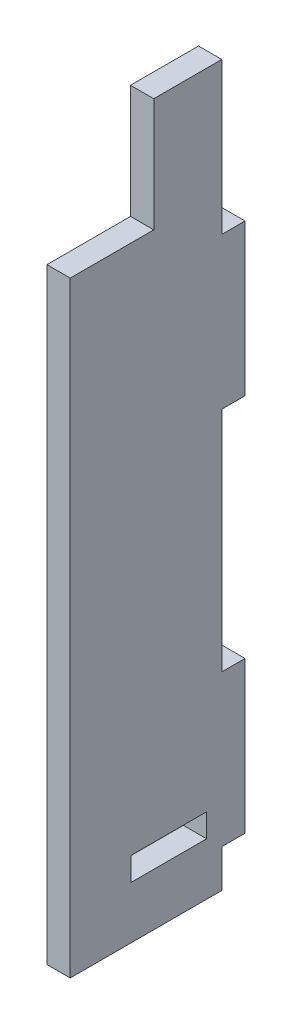
ISO-10303-21;
HEADER;
FILE_DESCRIPTION(('STEP AP214'),'2;1');
FILE_NAME('part.step','',(''),(''),'','','');
FILE_SCHEMA(('AUTOMOTIVE_DESIGN { 1 0 10303 214 1 1 1 1 }'));
ENDSEC;
DATA;
#1=APPLICATION_CONTEXT('core data for automotive mechanical design processes');
#2=APPLICATION_PROTOCOL_DEFINITION('international standard','automotive_design',2000,#1);
#3=PRODUCT_CONTEXT('',#1,'mechanical');
#4=PRODUCT('Part','Part','',(#3));
#5=PRODUCT_RELATED_PRODUCT_CATEGORY('part','',(#4));
#6=PRODUCT_DEFINITION_FORMATION('','',#4);
#7=PRODUCT_DEFINITION_CONTEXT('part definition',#1,'design');
#8=PRODUCT_DEFINITION('design','',#6,#7);
#9=PRODUCT_DEFINITION_SHAPE('','',#8);
#10=(LENGTH_UNIT() NAMED_UNIT(*) SI_UNIT(.MILLI.,.METRE.));
#11=(NAMED_UNIT(*) PLANE_ANGLE_UNIT() SI_UNIT($,.RADIAN.));
#12=(NAMED_UNIT(*) SI_UNIT($,.STERADIAN.) SOLID_ANGLE_UNIT());
#13=UNCERTAINTY_MEASURE_WITH_UNIT(LENGTH_MEASURE(1.E-05),#10,'distance_accuracy_value','');
#14=(GEOMETRIC_REPRESENTATION_CONTEXT(3) GLOBAL_UNCERTAINTY_ASSIGNED_CONTEXT((#13)) GLOBAL_UNIT_ASSIGNED_CONTEXT((#10,
#11,#12)) REPRESENTATION_CONTEXT('',''));
#15=CARTESIAN_POINT('',(0.,0.,0.));
#16=DIRECTION('',(0.,0.,1.));
#17=DIRECTION('',(1.,0.,0.));
#18=AXIS2_PLACEMENT_3D('',#15,#16,#17);
#19=CARTESIAN_POINT('',(45.07,-241.86,-3.08));
#20=DIRECTION('',(0.,0.,1.));
#21=DIRECTION('',(-1.,0.,0.));
#22=AXIS2_PLACEMENT_3D('',#19,#20,#21);
#23=PLANE('',#22);
#24=DIRECTION('',(0.,-1.,0.));
#25=VECTOR('',#24,1.);
#26=CARTESIAN_POINT('',(42.,-241.86,-3.08));
#27=LINE('',#26,#25);
#28=CARTESIAN_POINT('',(42.,-221.88,-3.08));
#29=VERTEX_POINT('',#28);
#30=CARTESIAN_POINT('',(42.,-241.86,-3.08));
#31=VERTEX_POINT('',#30);
#32=EDGE_CURVE('E190',#29,#31,#27,.T.);
#33=ORIENTED_EDGE('',*,*,#32,.F.);
#34=DIRECTION('',(-1.,0.,0.));
#35=VECTOR('',#34,1.);
#36=CARTESIAN_POINT('',(45.07,-221.88,-3.08));
#37=LINE('',#36,#35);
#38=CARTESIAN_POINT('',(45.07,-221.88,-3.08));
#39=VERTEX_POINT('',#38);
#40=EDGE_CURVE('E233',#39,#29,#37,.T.);
#41=ORIENTED_EDGE('',*,*,#40,.F.);
#42=DIRECTION('',(0.,-1.,0.));
#43=VECTOR('',#42,1.);
#44=CARTESIAN_POINT('',(45.07,-241.86,-3.08));
#45=LINE('',#44,#43);
#46=CARTESIAN_POINT('',(45.07,-241.86,-3.08));
#47=VERTEX_POINT('',#46);
#48=EDGE_CURVE('E191',#39,#47,#45,.T.);
#49=ORIENTED_EDGE('',*,*,#48,.T.);
#50=DIRECTION('',(-1.,0.,0.));
#51=VECTOR('',#50,1.);
#52=CARTESIAN_POINT('',(45.07,-241.86,-3.08));
#53=LINE('',#52,#51);
#54=EDGE_CURVE('E311',#47,#31,#53,.T.);
#55=ORIENTED_EDGE('',*,*,#54,.T.);
#56=EDGE_LOOP('',(#33,#41,#49,#55));
#57=FACE_BOUND('',#56,.T.);
#58=ADVANCED_FACE('F43',(#57),#23,.F.);
#59=CARTESIAN_POINT('',(45.07,-241.86,-0.0100000000000005));
#60=DIRECTION('',(0.,1.,0.));
#61=DIRECTION('',(0.,0.,1.));
#62=AXIS2_PLACEMENT_3D('',#59,#60,#61);
#63=PLANE('',#62);
#64=DIRECTION('',(0.,0.,1.));
#65=VECTOR('',#64,1.);
#66=CARTESIAN_POINT('',(42.,-241.86,-0.0100000000000005));
#67=LINE('',#66,#65);
#68=CARTESIAN_POINT('',(42.,-241.86,-0.0100000000000005));
#69=VERTEX_POINT('',#68);
#70=EDGE_CURVE('E236',#31,#69,#67,.T.);
#71=ORIENTED_EDGE('',*,*,#70,.F.);
#72=ORIENTED_EDGE('',*,*,#54,.F.);
#73=DIRECTION('',(0.,0.,1.));
#74=VECTOR('',#73,1.);
#75=CARTESIAN_POINT('',(45.07,-241.86,-0.0100000000000005));
#76=LINE('',#75,#74);
#77=CARTESIAN_POINT('',(45.07,-241.86,-0.0100000000000005));
#78=VERTEX_POINT('',#77);
#79=EDGE_CURVE('E194',#47,#78,#76,.T.);
#80=ORIENTED_EDGE('',*,*,#79,.T.);
#81=DIRECTION('',(-1.,0.,0.));
#82=VECTOR('',#81,1.);
#83=CARTESIAN_POINT('',(45.07,-241.86,-0.0100000000000005));
#84=LINE('',#83,#82);
#85=EDGE_CURVE('E308',#78,#69,#84,.T.);
#86=ORIENTED_EDGE('',*,*,#85,.T.);
#87=EDGE_LOOP('',(#71,#72,#80,#86));
#88=FACE_BOUND('',#87,.T.);
#89=ADVANCED_FACE('F341',(#88),#63,.F.);
#90=CARTESIAN_POINT('',(45.07,-271.88,-0.0100000000000005));
#91=DIRECTION('',(0.,0.,1.));
#92=DIRECTION('',(-1.,0.,0.));
#93=AXIS2_PLACEMENT_3D('',#90,#91,#92);
#94=PLANE('',#93);
#95=DIRECTION('',(0.,-1.,0.));
#96=VECTOR('',#95,1.);
#97=CARTESIAN_POINT('',(42.,-271.88,-0.0100000000000005));
#98=LINE('',#97,#96);
#99=CARTESIAN_POINT('',(42.,-271.88,-0.0100000000000005));
#100=VERTEX_POINT('',#99);
#101=EDGE_CURVE('E239',#69,#100,#98,.T.);
#102=ORIENTED_EDGE('',*,*,#101,.F.);
#103=ORIENTED_EDGE('',*,*,#85,.F.);
#104=DIRECTION('',(0.,-1.,0.));
#105=VECTOR('',#104,1.);
#106=CARTESIAN_POINT('',(45.07,-271.88,-0.0100000000000005));
#107=LINE('',#106,#105);
#108=CARTESIAN_POINT('',(45.07,-271.88,-0.0100000000000005));
#109=VERTEX_POINT('',#108);
#110=EDGE_CURVE('E198',#78,#109,#107,.T.);
#111=ORIENTED_EDGE('',*,*,#110,.T.);
#112=DIRECTION('',(-1.,0.,0.));
#113=VECTOR('',#112,1.);
#114=CARTESIAN_POINT('',(45.07,-271.88,-0.0100000000000005));
#115=LINE('',#114,#113);
#116=EDGE_CURVE('E305',#109,#100,#115,.T.);
#117=ORIENTED_EDGE('',*,*,#116,.T.);
#118=EDGE_LOOP('',(#102,#103,#111,#117));
#119=FACE_BOUND('',#118,.T.);
#120=ADVANCED_FACE('F347',(#119),#94,.F.);
#121=CARTESIAN_POINT('',(45.07,-271.88,-0.0100000000000005));
#122=DIRECTION('',(0.,-1.,0.));
#123=DIRECTION('',(0.,0.,-1.));
#124=AXIS2_PLACEMENT_3D('',#121,#122,#123);
#125=PLANE('',#124);
#126=DIRECTION('',(0.,0.,-1.));
#127=VECTOR('',#126,1.);
#128=CARTESIAN_POINT('',(42.,-271.88,-0.0100000000000005));
#129=LINE('',#128,#127);
#130=CARTESIAN_POINT('',(42.,-271.88,-3.08));
#131=VERTEX_POINT('',#130);
#132=EDGE_CURVE('E242',#100,#131,#129,.T.);
#133=ORIENTED_EDGE('',*,*,#132,.F.);
#134=ORIENTED_EDGE('',*,*,#116,.F.);
#135=DIRECTION('',(0.,0.,-1.));
#136=VECTOR('',#135,1.);
#137=CARTESIAN_POINT('',(45.07,-271.88,-0.0100000000000005));
#138=LINE('',#137,#136);
#139=CARTESIAN_POINT('',(45.07,-271.88,-3.08));
#140=VERTEX_POINT('',#139);
#141=EDGE_CURVE('E201',#109,#140,#138,.T.);
#142=ORIENTED_EDGE('',*,*,#141,.T.);
#143=DIRECTION('',(-1.,0.,0.));
#144=VECTOR('',#143,1.);
#145=CARTESIAN_POINT('',(45.07,-271.88,-3.08));
#146=LINE('',#145,#144);
#147=EDGE_CURVE('E302',#140,#131,#146,.T.);
#148=ORIENTED_EDGE('',*,*,#147,.T.);
#149=EDGE_LOOP('',(#133,#134,#142,#148));
#150=FACE_BOUND('',#149,.T.);
#151=ADVANCED_FACE('F360',(#150),#125,.F.);
#152=CARTESIAN_POINT('',(45.07,-271.88,-3.08));
#153=DIRECTION('',(0.,0.,1.));
#154=DIRECTION('',(-1.,0.,0.));
#155=AXIS2_PLACEMENT_3D('',#152,#153,#154);
#156=PLANE('',#155);
#157=DIRECTION('',(0.,-1.,0.));
#158=VECTOR('',#157,1.);
#159=CARTESIAN_POINT('',(42.,-271.88,-3.08));
#160=LINE('',#159,#158);
#161=CARTESIAN_POINT('',(42.,-291.86,-3.08));
#162=VERTEX_POINT('',#161);
#163=EDGE_CURVE('E245',#131,#162,#160,.T.);
#164=ORIENTED_EDGE('',*,*,#163,.F.);
#165=ORIENTED_EDGE('',*,*,#147,.F.);
#166=DIRECTION('',(0.,-1.,0.));
#167=VECTOR('',#166,1.);
#168=CARTESIAN_POINT('',(45.07,-271.88,-3.08));
#169=LINE('',#168,#167);
#170=CARTESIAN_POINT('',(45.07,-291.86,-3.08));
#171=VERTEX_POINT('',#170);
#172=EDGE_CURVE('E204',#140,#171,#169,.T.);
#173=ORIENTED_EDGE('',*,*,#172,.T.);
#174=DIRECTION('',(-1.,0.,0.));
#175=VECTOR('',#174,1.);
#176=CARTESIAN_POINT('',(45.07,-291.86,-3.08));
#177=LINE('',#176,#175);
#178=EDGE_CURVE('E299',#171,#162,#177,.T.);
#179=ORIENTED_EDGE('',*,*,#178,.T.);
#180=EDGE_LOOP('',(#164,#165,#173,#179));
#181=FACE_BOUND('',#180,.T.);
#182=ADVANCED_FACE('F363',(#181),#156,.F.);
#183=CARTESIAN_POINT('',(45.07,-291.86,-3.08));
#184=DIRECTION('',(0.,1.,0.));
#185=DIRECTION('',(0.,0.,1.));
#186=AXIS2_PLACEMENT_3D('',#183,#184,#185);
#187=PLANE('',#186);
#188=DIRECTION('',(0.,0.,1.));
#189=VECTOR('',#188,1.);
#190=CARTESIAN_POINT('',(42.,-291.86,-3.08));
#191=LINE('',#190,#189);
#192=CARTESIAN_POINT('',(42.,-291.86,-0.0100000000000005));
#193=VERTEX_POINT('',#192);
#194=EDGE_CURVE('E248',#162,#193,#191,.T.);
#195=ORIENTED_EDGE('',*,*,#194,.F.);
#196=ORIENTED_EDGE('',*,*,#178,.F.);
#197=DIRECTION('',(0.,0.,1.));
#198=VECTOR('',#197,1.);
#199=CARTESIAN_POINT('',(45.07,-291.86,-3.08));
#200=LINE('',#199,#198);
#201=CARTESIAN_POINT('',(45.07,-291.86,-0.0100000000000005));
#202=VERTEX_POINT('',#201);
#203=EDGE_CURVE('E207',#171,#202,#200,.T.);
#204=ORIENTED_EDGE('',*,*,#203,.T.);
#205=DIRECTION('',(-1.,0.,0.));
#206=VECTOR('',#205,1.);
#207=CARTESIAN_POINT('',(45.07,-291.86,-0.0100000000000005));
#208=LINE('',#207,#206);
#209=EDGE_CURVE('E296',#202,#193,#208,.T.);
#210=ORIENTED_EDGE('',*,*,#209,.T.);
#211=EDGE_LOOP('',(#195,#196,#204,#210));
#212=FACE_BOUND('',#211,.T.);
#213=ADVANCED_FACE('F366',(#212),#187,.F.);
#214=CARTESIAN_POINT('',(45.07,-296.87,-0.0100000000000005));
#215=DIRECTION('',(0.,0.,1.));
#216=DIRECTION('',(-1.,0.,0.));
#217=AXIS2_PLACEMENT_3D('',#214,#215,#216);
#218=PLANE('',#217);
#219=DIRECTION('',(0.,-1.,0.));
#220=VECTOR('',#219,1.);
#221=CARTESIAN_POINT('',(42.,-296.87,-0.0100000000000005));
#222=LINE('',#221,#220);
#223=CARTESIAN_POINT('',(42.,-296.87,-0.0100000000000005));
#224=VERTEX_POINT('',#223);
#225=EDGE_CURVE('E251',#193,#224,#222,.T.);
#226=ORIENTED_EDGE('',*,*,#225,.F.);
#227=ORIENTED_EDGE('',*,*,#209,.F.);
#228=DIRECTION('',(0.,-1.,0.));
#229=VECTOR('',#228,1.);
#230=CARTESIAN_POINT('',(45.07,-296.87,-0.0100000000000005));
#231=LINE('',#230,#229);
#232=CARTESIAN_POINT('',(45.07,-296.87,-0.0100000000000005));
#233=VERTEX_POINT('',#232);
#234=EDGE_CURVE('E210',#202,#233,#231,.T.);
#235=ORIENTED_EDGE('',*,*,#234,.T.);
#236=DIRECTION('',(-1.,0.,0.));
#237=VECTOR('',#236,1.);
#238=CARTESIAN_POINT('',(45.07,-296.87,-0.0100000000000005));
#239=LINE('',#238,#237);
#240=EDGE_CURVE('E293',#233,#224,#239,.T.);
#241=ORIENTED_EDGE('',*,*,#240,.T.);
#242=EDGE_LOOP('',(#226,#227,#235,#241));
#243=FACE_BOUND('',#242,.T.);
#244=ADVANCED_FACE('F369',(#243),#218,.F.);
#245=CARTESIAN_POINT('',(45.07,-296.87,19.99));
#246=DIRECTION('',(0.,1.,0.));
#247=DIRECTION('',(0.,0.,1.));
#248=AXIS2_PLACEMENT_3D('',#245,#246,#247);
#249=PLANE('',#248);
#250=DIRECTION('',(0.,0.,1.));
#251=VECTOR('',#250,1.);
#252=CARTESIAN_POINT('',(42.,-296.87,19.99));
#253=LINE('',#252,#251);
#254=CARTESIAN_POINT('',(42.,-296.87,19.99));
#255=VERTEX_POINT('',#254);
#256=EDGE_CURVE('E254',#224,#255,#253,.T.);
#257=ORIENTED_EDGE('',*,*,#256,.F.);
#258=ORIENTED_EDGE('',*,*,#240,.F.);
#259=DIRECTION('',(0.,0.,1.));
#260=VECTOR('',#259,1.);
#261=CARTESIAN_POINT('',(45.07,-296.87,19.99));
#262=LINE('',#261,#260);
#263=CARTESIAN_POINT('',(45.07,-296.87,19.99));
#264=VERTEX_POINT('',#263);
#265=EDGE_CURVE('E213',#233,#264,#262,.T.);
#266=ORIENTED_EDGE('',*,*,#265,.T.);
#267=DIRECTION('',(-1.,0.,0.));
#268=VECTOR('',#267,1.);
#269=CARTESIAN_POINT('',(45.07,-296.87,19.99));
#270=LINE('',#269,#268);
#271=EDGE_CURVE('E290',#264,#255,#270,.T.);
#272=ORIENTED_EDGE('',*,*,#271,.T.);
#273=EDGE_LOOP('',(#257,#258,#266,#272));
#274=FACE_BOUND('',#273,.T.);
#275=ADVANCED_FACE('F372',(#274),#249,.F.);
#276=CARTESIAN_POINT('',(45.07,-216.87,19.99));
#277=DIRECTION('',(0.,0.,-1.));
#278=DIRECTION('',(0.,1.,0.));
#279=AXIS2_PLACEMENT_3D('',#276,#277,#278);
#280=PLANE('',#279);
#281=DIRECTION('',(0.,1.,0.));
#282=VECTOR('',#281,1.);
#283=CARTESIAN_POINT('',(42.,-216.87,19.99));
#284=LINE('',#283,#282);
#285=CARTESIAN_POINT('',(42.,-216.87,19.99));
#286=VERTEX_POINT('',#285);
#287=EDGE_CURVE('E257',#255,#286,#284,.T.);
#288=ORIENTED_EDGE('',*,*,#287,.F.);
#289=ORIENTED_EDGE('',*,*,#271,.F.);
#290=DIRECTION('',(0.,1.,0.));
#291=VECTOR('',#290,1.);
#292=CARTESIAN_POINT('',(45.07,-216.87,19.99));
#293=LINE('',#292,#291);
#294=CARTESIAN_POINT('',(45.07,-216.87,19.99));
#295=VERTEX_POINT('',#294);
#296=EDGE_CURVE('E216',#264,#295,#293,.T.);
#297=ORIENTED_EDGE('',*,*,#296,.T.);
#298=DIRECTION('',(-1.,0.,0.));
#299=VECTOR('',#298,1.);
#300=CARTESIAN_POINT('',(45.07,-216.87,19.99));
#301=LINE('',#300,#299);
#302=EDGE_CURVE('E287',#295,#286,#301,.T.);
#303=ORIENTED_EDGE('',*,*,#302,.T.);
#304=EDGE_LOOP('',(#288,#289,#297,#303));
#305=FACE_BOUND('',#304,.T.);
#306=ADVANCED_FACE('F375',(#305),#280,.F.);
#307=CARTESIAN_POINT('',(45.07,-216.87,8.96499999999999));
#308=DIRECTION('',(0.,-1.,0.));
#309=DIRECTION('',(0.,0.,-1.));
#310=AXIS2_PLACEMENT_3D('',#307,#308,#309);
#311=PLANE('',#310);
#312=DIRECTION('',(0.,0.,-1.));
#313=VECTOR('',#312,1.);
#314=CARTESIAN_POINT('',(42.,-216.87,8.96499999999999));
#315=LINE('',#314,#313);
#316=CARTESIAN_POINT('',(42.,-216.87,8.96499999999999));
#317=VERTEX_POINT('',#316);
#318=EDGE_CURVE('E260',#286,#317,#315,.T.);
#319=ORIENTED_EDGE('',*,*,#318,.F.);
#320=ORIENTED_EDGE('',*,*,#302,.F.);
#321=DIRECTION('',(0.,0.,-1.));
#322=VECTOR('',#321,1.);
#323=CARTESIAN_POINT('',(45.07,-216.87,8.96499999999999));
#324=LINE('',#323,#322);
#325=CARTESIAN_POINT('',(45.07,-216.87,8.96499999999999));
#326=VERTEX_POINT('',#325);
#327=EDGE_CURVE('E219',#295,#326,#324,.T.);
#328=ORIENTED_EDGE('',*,*,#327,.T.);
#329=DIRECTION('',(-1.,0.,0.));
#330=VECTOR('',#329,1.);
#331=CARTESIAN_POINT('',(45.07,-216.87,8.96499999999999));
#332=LINE('',#331,#330);
#333=EDGE_CURVE('E284',#326,#317,#332,.T.);
#334=ORIENTED_EDGE('',*,*,#333,.T.);
#335=EDGE_LOOP('',(#319,#320,#328,#334));
#336=FACE_BOUND('',#335,.T.);
#337=ADVANCED_FACE('F378',(#336),#311,.F.);
#338=CARTESIAN_POINT('',(45.07,-201.88,8.96499999999998));
#339=DIRECTION('',(0.,0.,-1.));
#340=DIRECTION('',(0.,1.,0.));
#341=AXIS2_PLACEMENT_3D('',#338,#339,#340);
#342=PLANE('',#341);
#343=DIRECTION('',(0.,1.,0.));
#344=VECTOR('',#343,1.);
#345=CARTESIAN_POINT('',(42.,-201.88,8.96499999999998));
#346=LINE('',#345,#344);
#347=CARTESIAN_POINT('',(42.,-201.88,8.96499999999998));
#348=VERTEX_POINT('',#347);
#349=EDGE_CURVE('E263',#317,#348,#346,.T.);
#350=ORIENTED_EDGE('',*,*,#349,.F.);
#351=ORIENTED_EDGE('',*,*,#333,.F.);
#352=DIRECTION('',(0.,1.,0.));
#353=VECTOR('',#352,1.);
#354=CARTESIAN_POINT('',(45.07,-201.88,8.96499999999998));
#355=LINE('',#354,#353);
#356=CARTESIAN_POINT('',(45.07,-201.88,8.96499999999998));
#357=VERTEX_POINT('',#356);
#358=EDGE_CURVE('E222',#326,#357,#355,.T.);
#359=ORIENTED_EDGE('',*,*,#358,.T.);
#360=DIRECTION('',(-1.,0.,0.));
#361=VECTOR('',#360,1.);
#362=CARTESIAN_POINT('',(45.07,-201.88,8.96499999999998));
#363=LINE('',#362,#361);
#364=EDGE_CURVE('E281',#357,#348,#363,.T.);
#365=ORIENTED_EDGE('',*,*,#364,.T.);
#366=EDGE_LOOP('',(#350,#351,#359,#365));
#367=FACE_BOUND('',#366,.T.);
#368=ADVANCED_FACE('F381',(#367),#342,.F.);
#369=CARTESIAN_POINT('',(45.07,-201.88,-0.0100000000000029));
#370=DIRECTION('',(0.,-1.,0.));
#371=DIRECTION('',(0.,0.,-1.));
#372=AXIS2_PLACEMENT_3D('',#369,#370,#371);
#373=PLANE('',#372);
#374=DIRECTION('',(0.,0.,-1.));
#375=VECTOR('',#374,1.);
#376=CARTESIAN_POINT('',(42.,-201.88,-0.0100000000000029));
#377=LINE('',#376,#375);
#378=CARTESIAN_POINT('',(42.,-201.88,-0.0100000000000029));
#379=VERTEX_POINT('',#378);
#380=EDGE_CURVE('E266',#348,#379,#377,.T.);
#381=ORIENTED_EDGE('',*,*,#380,.F.);
#382=ORIENTED_EDGE('',*,*,#364,.F.);
#383=DIRECTION('',(0.,0.,-1.));
#384=VECTOR('',#383,1.);
#385=CARTESIAN_POINT('',(45.07,-201.88,-0.0100000000000029));
#386=LINE('',#385,#384);
#387=CARTESIAN_POINT('',(45.07,-201.88,-0.0100000000000029));
#388=VERTEX_POINT('',#387);
#389=EDGE_CURVE('E225',#357,#388,#386,.T.);
#390=ORIENTED_EDGE('',*,*,#389,.T.);
#391=DIRECTION('',(-1.,0.,0.));
#392=VECTOR('',#391,1.);
#393=CARTESIAN_POINT('',(45.07,-201.88,-0.0100000000000029));
#394=LINE('',#393,#392);
#395=EDGE_CURVE('E278',#388,#379,#394,.T.);
#396=ORIENTED_EDGE('',*,*,#395,.T.);
#397=EDGE_LOOP('',(#381,#382,#390,#396));
#398=FACE_BOUND('',#397,.T.);
#399=ADVANCED_FACE('F384',(#398),#373,.F.);
#400=CARTESIAN_POINT('',(45.07,-221.88,-0.0100000000000005));
#401=DIRECTION('',(0.,0.,1.));
#402=DIRECTION('',(0.,-1.,0.));
#403=AXIS2_PLACEMENT_3D('',#400,#401,#402);
#404=PLANE('',#403);
#405=DIRECTION('',(0.,-1.,0.));
#406=VECTOR('',#405,1.);
#407=CARTESIAN_POINT('',(42.,-221.88,-0.0100000000000005));
#408=LINE('',#407,#406);
#409=CARTESIAN_POINT('',(42.,-221.88,-0.0100000000000005));
#410=VERTEX_POINT('',#409);
#411=EDGE_CURVE('E269',#379,#410,#408,.T.);
#412=ORIENTED_EDGE('',*,*,#411,.F.);
#413=ORIENTED_EDGE('',*,*,#395,.F.);
#414=DIRECTION('',(0.,-1.,0.));
#415=VECTOR('',#414,1.);
#416=CARTESIAN_POINT('',(45.07,-221.88,-0.0100000000000005));
#417=LINE('',#416,#415);
#418=CARTESIAN_POINT('',(45.07,-221.88,-0.0100000000000005));
#419=VERTEX_POINT('',#418);
#420=EDGE_CURVE('E228',#388,#419,#417,.T.);
#421=ORIENTED_EDGE('',*,*,#420,.T.);
#422=DIRECTION('',(-1.,0.,0.));
#423=VECTOR('',#422,1.);
#424=CARTESIAN_POINT('',(45.07,-221.88,-0.0100000000000005));
#425=LINE('',#424,#423);
#426=EDGE_CURVE('E275',#419,#410,#425,.T.);
#427=ORIENTED_EDGE('',*,*,#426,.T.);
#428=EDGE_LOOP('',(#412,#413,#421,#427));
#429=FACE_BOUND('',#428,.T.);
#430=ADVANCED_FACE('F387',(#429),#404,.F.);
#431=CARTESIAN_POINT('',(45.07,-221.88,-3.08));
#432=DIRECTION('',(0.,-1.,0.));
#433=DIRECTION('',(0.,0.,-1.));
#434=AXIS2_PLACEMENT_3D('',#431,#432,#433);
#435=PLANE('',#434);
#436=DIRECTION('',(0.,0.,-1.));
#437=VECTOR('',#436,1.);
#438=CARTESIAN_POINT('',(42.,-221.88,-3.08));
#439=LINE('',#438,#437);
#440=EDGE_CURVE('E195',#410,#29,#439,.T.);
#441=ORIENTED_EDGE('',*,*,#440,.F.);
#442=ORIENTED_EDGE('',*,*,#426,.F.);
#443=DIRECTION('',(0.,0.,-1.));
#444=VECTOR('',#443,1.);
#445=CARTESIAN_POINT('',(45.07,-221.88,-3.08));
#446=LINE('',#445,#444);
#447=EDGE_CURVE('E231',#419,#39,#446,.T.);
#448=ORIENTED_EDGE('',*,*,#447,.T.);
#449=ORIENTED_EDGE('',*,*,#40,.T.);
#450=EDGE_LOOP('',(#441,#442,#448,#449));
#451=FACE_BOUND('',#450,.T.);
#452=ADVANCED_FACE('F354',(#451),#435,.F.);
#453=CARTESIAN_POINT('',(45.07,0.,0.));
#454=DIRECTION('',(-1.,0.,0.));
#455=DIRECTION('',(0.,0.,-1.));
#456=AXIS2_PLACEMENT_3D('',#453,#454,#455);
#457=PLANE('',#456);
#458=DIRECTION('',(0.,0.,-1.));
#459=VECTOR('',#458,1.);
#460=CARTESIAN_POINT('',(45.07,-286.87,0.));
#461=LINE('',#460,#459);
#462=CARTESIAN_POINT('',(45.0699999999999,-286.87,11.99));
#463=VERTEX_POINT('',#462);
#464=CARTESIAN_POINT('',(45.07,-286.87,1.99000000000001));
#465=VERTEX_POINT('',#464);
#466=EDGE_CURVE('E163',#463,#465,#461,.T.);
#467=ORIENTED_EDGE('',*,*,#466,.T.);
#468=DIRECTION('',(0.,-1.,0.));
#469=VECTOR('',#468,1.);
#470=CARTESIAN_POINT('',(45.07,0.,1.98999999999984));
#471=LINE('',#470,#469);
#472=CARTESIAN_POINT('',(45.0699999999999,-289.96,1.99000000000001));
#473=VERTEX_POINT('',#472);
#474=EDGE_CURVE('E185',#465,#473,#471,.T.);
#475=ORIENTED_EDGE('',*,*,#474,.T.);
#476=DIRECTION('',(0.,0.,1.));
#477=VECTOR('',#476,1.);
#478=CARTESIAN_POINT('',(45.07,-289.96,0.));
#479=LINE('',#478,#477);
#480=CARTESIAN_POINT('',(45.0699999999999,-289.96,11.99));
#481=VERTEX_POINT('',#480);
#482=EDGE_CURVE('E183',#473,#481,#479,.T.);
#483=ORIENTED_EDGE('',*,*,#482,.T.);
#484=DIRECTION('',(0.,1.,0.));
#485=VECTOR('',#484,1.);
#486=CARTESIAN_POINT('',(45.07,0.,11.99));
#487=LINE('',#486,#485);
#488=EDGE_CURVE('E168',#481,#463,#487,.T.);
#489=ORIENTED_EDGE('',*,*,#488,.T.);
#490=EDGE_LOOP('',(#467,#475,#483,#489));
#491=FACE_BOUND('',#490,.T.);
#492=ORIENTED_EDGE('',*,*,#48,.F.);
#493=ORIENTED_EDGE('',*,*,#447,.F.);
#494=ORIENTED_EDGE('',*,*,#420,.F.);
#495=ORIENTED_EDGE('',*,*,#389,.F.);
#496=ORIENTED_EDGE('',*,*,#358,.F.);
#497=ORIENTED_EDGE('',*,*,#327,.F.);
#498=ORIENTED_EDGE('',*,*,#296,.F.);
#499=ORIENTED_EDGE('',*,*,#265,.F.);
#500=ORIENTED_EDGE('',*,*,#234,.F.);
#501=ORIENTED_EDGE('',*,*,#203,.F.);
#502=ORIENTED_EDGE('',*,*,#172,.F.);
#503=ORIENTED_EDGE('',*,*,#141,.F.);
#504=ORIENTED_EDGE('',*,*,#110,.F.);
#505=ORIENTED_EDGE('',*,*,#79,.F.);
#506=EDGE_LOOP('',(#492,#493,#494,#495,#496,#497,#498,#499,#500,#501,#502,#503,#504,#505));
#507=FACE_BOUND('',#506,.T.);
#508=ADVANCED_FACE('F181',(#491,#507),#457,.F.);
#509=CARTESIAN_POINT('',(42.,0.,0.));
#510=DIRECTION('',(-1.,0.,0.));
#511=DIRECTION('',(0.,0.,-1.));
#512=AXIS2_PLACEMENT_3D('',#509,#510,#511);
#513=PLANE('',#512);
#514=DIRECTION('',(0.,-1.,0.));
#515=VECTOR('',#514,1.);
#516=CARTESIAN_POINT('',(42.,0.,1.98999999999984));
#517=LINE('',#516,#515);
#518=CARTESIAN_POINT('',(42.,-286.87,1.99000000000001));
#519=VERTEX_POINT('',#518);
#520=CARTESIAN_POINT('',(42.,-289.96,1.99000000000001));
#521=VERTEX_POINT('',#520);
#522=EDGE_CURVE('E11',#519,#521,#517,.T.);
#523=ORIENTED_EDGE('',*,*,#522,.F.);
#524=DIRECTION('',(0.,0.,-1.));
#525=VECTOR('',#524,1.);
#526=CARTESIAN_POINT('',(42.,-286.87,0.));
#527=LINE('',#526,#525);
#528=CARTESIAN_POINT('',(42.,-286.87,11.99));
#529=VERTEX_POINT('',#528);
#530=EDGE_CURVE('E314',#529,#519,#527,.T.);
#531=ORIENTED_EDGE('',*,*,#530,.F.);
#532=DIRECTION('',(0.,1.,0.));
#533=VECTOR('',#532,1.);
#534=CARTESIAN_POINT('',(42.,0.,11.99));
#535=LINE('',#534,#533);
#536=CARTESIAN_POINT('',(42.,-289.96,11.99));
#537=VERTEX_POINT('',#536);
#538=EDGE_CURVE('E176',#537,#529,#535,.T.);
#539=ORIENTED_EDGE('',*,*,#538,.F.);
#540=DIRECTION('',(0.,0.,1.));
#541=VECTOR('',#540,1.);
#542=CARTESIAN_POINT('',(42.,-289.96,0.));
#543=LINE('',#542,#541);
#544=EDGE_CURVE('E50',#521,#537,#543,.T.);
#545=ORIENTED_EDGE('',*,*,#544,.F.);
#546=EDGE_LOOP('',(#523,#531,#539,#545));
#547=FACE_BOUND('',#546,.T.);
#548=ORIENTED_EDGE('',*,*,#32,.T.);
#549=ORIENTED_EDGE('',*,*,#70,.T.);
#550=ORIENTED_EDGE('',*,*,#101,.T.);
#551=ORIENTED_EDGE('',*,*,#132,.T.);
#552=ORIENTED_EDGE('',*,*,#163,.T.);
#553=ORIENTED_EDGE('',*,*,#194,.T.);
#554=ORIENTED_EDGE('',*,*,#225,.T.);
#555=ORIENTED_EDGE('',*,*,#256,.T.);
#556=ORIENTED_EDGE('',*,*,#287,.T.);
#557=ORIENTED_EDGE('',*,*,#318,.T.);
#558=ORIENTED_EDGE('',*,*,#349,.T.);
#559=ORIENTED_EDGE('',*,*,#380,.T.);
#560=ORIENTED_EDGE('',*,*,#411,.T.);
#561=ORIENTED_EDGE('',*,*,#440,.T.);
#562=EDGE_LOOP('',(#548,#549,#550,#551,#552,#553,#554,#555,#556,#557,#558,#559,#560,#561));
#563=FACE_BOUND('',#562,.T.);
#564=ADVANCED_FACE('F324',(#547,#563),#513,.T.);
#565=CARTESIAN_POINT('',(-130.,-289.96,1.99000000000001));
#566=DIRECTION('',(0.,0.,-1.));
#567=DIRECTION('',(0.,1.,0.));
#568=AXIS2_PLACEMENT_3D('',#565,#566,#567);
#569=PLANE('',#568);
#570=DIRECTION('',(1.,0.,0.));
#571=VECTOR('',#570,1.);
#572=CARTESIAN_POINT('',(-130.,-286.87,1.99000000000001));
#573=LINE('',#572,#571);
#574=EDGE_CURVE('E57',#519,#465,#573,.T.);
#575=ORIENTED_EDGE('',*,*,#574,.F.);
#576=ORIENTED_EDGE('',*,*,#522,.T.);
#577=DIRECTION('',(1.,0.,0.));
#578=VECTOR('',#577,1.);
#579=CARTESIAN_POINT('',(-130.,-289.96,1.99000000000001));
#580=LINE('',#579,#578);
#581=EDGE_CURVE('E169',#521,#473,#580,.T.);
#582=ORIENTED_EDGE('',*,*,#581,.T.);
#583=ORIENTED_EDGE('',*,*,#474,.F.);
#584=EDGE_LOOP('',(#575,#576,#582,#583));
#585=FACE_BOUND('',#584,.T.);
#586=ADVANCED_FACE('F327',(#585),#569,.F.);
#587=CARTESIAN_POINT('',(-130.,-289.96,11.99));
#588=DIRECTION('',(0.,-1.,0.));
#589=DIRECTION('',(0.,0.,-1.));
#590=AXIS2_PLACEMENT_3D('',#587,#588,#589);
#591=PLANE('',#590);
#592=ORIENTED_EDGE('',*,*,#581,.F.);
#593=ORIENTED_EDGE('',*,*,#544,.T.);
#594=DIRECTION('',(1.,0.,0.));
#595=VECTOR('',#594,1.);
#596=CARTESIAN_POINT('',(-130.,-289.96,11.99));
#597=LINE('',#596,#595);
#598=EDGE_CURVE('E178',#537,#481,#597,.T.);
#599=ORIENTED_EDGE('',*,*,#598,.T.);
#600=ORIENTED_EDGE('',*,*,#482,.F.);
#601=EDGE_LOOP('',(#592,#593,#599,#600));
#602=FACE_BOUND('',#601,.T.);
#603=ADVANCED_FACE('F319',(#602),#591,.F.);
#604=CARTESIAN_POINT('',(-130.,-286.87,11.99));
#605=DIRECTION('',(0.,0.,1.));
#606=DIRECTION('',(1.,0.,0.));
#607=AXIS2_PLACEMENT_3D('',#604,#605,#606);
#608=PLANE('',#607);
#609=ORIENTED_EDGE('',*,*,#598,.F.);
#610=ORIENTED_EDGE('',*,*,#538,.T.);
#611=DIRECTION('',(1.,0.,0.));
#612=VECTOR('',#611,1.);
#613=CARTESIAN_POINT('',(-130.,-286.87,11.99));
#614=LINE('',#613,#612);
#615=EDGE_CURVE('E62',#529,#463,#614,.T.);
#616=ORIENTED_EDGE('',*,*,#615,.T.);
#617=ORIENTED_EDGE('',*,*,#488,.F.);
#618=EDGE_LOOP('',(#609,#610,#616,#617));
#619=FACE_BOUND('',#618,.T.);
#620=ADVANCED_FACE('F173',(#619),#608,.F.);
#621=CARTESIAN_POINT('',(-130.,-286.87,1.99000000000001));
#622=DIRECTION('',(0.,1.,0.));
#623=DIRECTION('',(0.,0.,1.));
#624=AXIS2_PLACEMENT_3D('',#621,#622,#623);
#625=PLANE('',#624);
#626=ORIENTED_EDGE('',*,*,#615,.F.);
#627=ORIENTED_EDGE('',*,*,#530,.T.);
#628=ORIENTED_EDGE('',*,*,#574,.T.);
#629=ORIENTED_EDGE('',*,*,#466,.F.);
#630=EDGE_LOOP('',(#626,#627,#628,#629));
#631=FACE_BOUND('',#630,.T.);
#632=ADVANCED_FACE('F164',(#631),#625,.F.);
#633=CLOSED_SHELL('',(#58,#89,#120,#151,#182,#213,#244,#275,#306,#337,#368,#399,#430,#452,#508,
#564,#586,#603,#620,#632));
#634=MANIFOLD_SOLID_BREP('B2',#633);
#635=ADVANCED_BREP_SHAPE_REPRESENTATION('',(#18,#634),#14);
#636=SHAPE_DEFINITION_REPRESENTATION(#9,#635);
ENDSEC;
END-ISO-10303-21;
